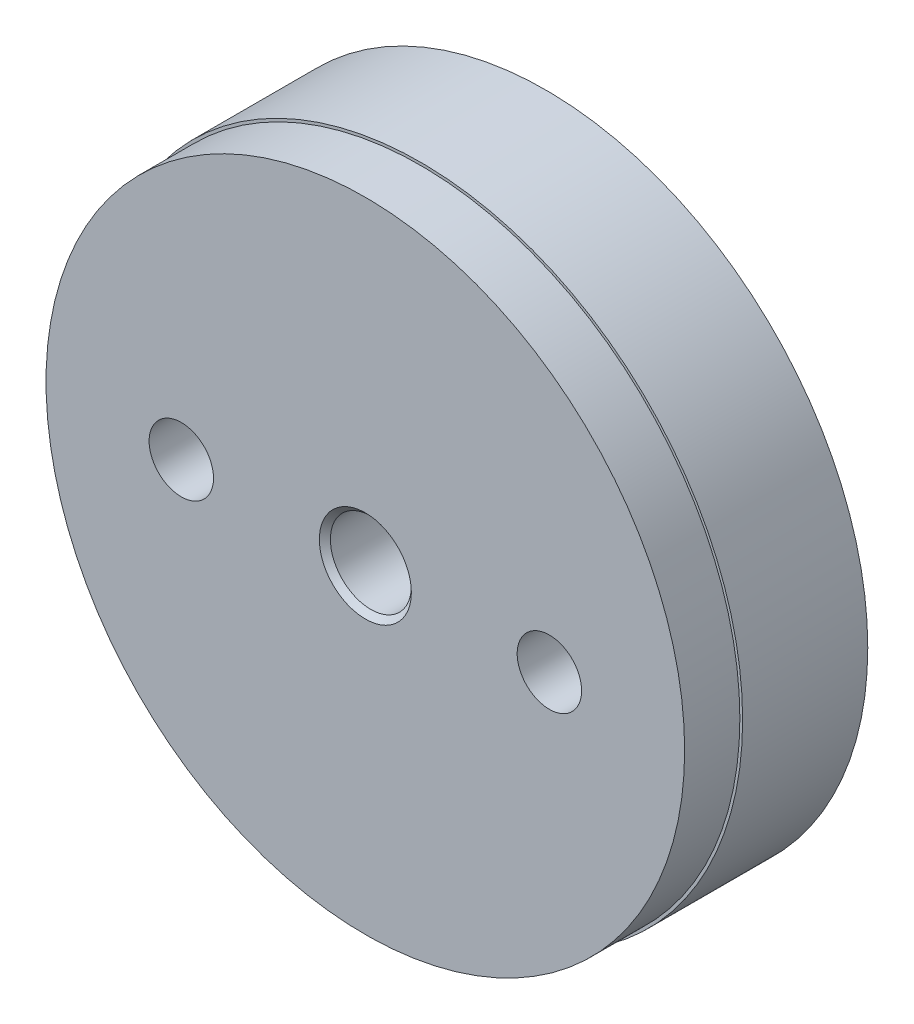
ISO-10303-21;
HEADER;
FILE_DESCRIPTION(('STEP AP214'),'2;1');
FILE_NAME('part.step','',(''),(''),'','','');
FILE_SCHEMA(('AUTOMOTIVE_DESIGN { 1 0 10303 214 1 1 1 1 }'));
ENDSEC;
DATA;
#1=APPLICATION_CONTEXT('core data for automotive mechanical design processes');
#2=APPLICATION_PROTOCOL_DEFINITION('international standard','automotive_design',2000,#1);
#3=PRODUCT_CONTEXT('',#1,'mechanical');
#4=PRODUCT('Part','Part','',(#3));
#5=PRODUCT_RELATED_PRODUCT_CATEGORY('part','',(#4));
#6=PRODUCT_DEFINITION_FORMATION('','',#4);
#7=PRODUCT_DEFINITION_CONTEXT('part definition',#1,'design');
#8=PRODUCT_DEFINITION('design','',#6,#7);
#9=PRODUCT_DEFINITION_SHAPE('','',#8);
#10=(LENGTH_UNIT() NAMED_UNIT(*) SI_UNIT(.MILLI.,.METRE.));
#11=(NAMED_UNIT(*) PLANE_ANGLE_UNIT() SI_UNIT($,.RADIAN.));
#12=(NAMED_UNIT(*) SI_UNIT($,.STERADIAN.) SOLID_ANGLE_UNIT());
#13=UNCERTAINTY_MEASURE_WITH_UNIT(LENGTH_MEASURE(1.E-05),#10,'distance_accuracy_value','');
#14=(GEOMETRIC_REPRESENTATION_CONTEXT(3) GLOBAL_UNCERTAINTY_ASSIGNED_CONTEXT((#13)) GLOBAL_UNIT_ASSIGNED_CONTEXT((#10,
#11,#12)) REPRESENTATION_CONTEXT('',''));
#15=CARTESIAN_POINT('',(0.,0.,0.));
#16=DIRECTION('',(0.,0.,1.));
#17=DIRECTION('',(1.,0.,0.));
#18=AXIS2_PLACEMENT_3D('',#15,#16,#17);
#19=CARTESIAN_POINT('',(0.,0.,49.));
#20=DIRECTION('',(0.,0.,-1.));
#21=DIRECTION('',(-1.,0.,0.));
#22=AXIS2_PLACEMENT_3D('',#19,#20,#21);
#23=CYLINDRICAL_SURFACE('',#22,87.5);
#24=CARTESIAN_POINT('',(0.,0.,0.));
#25=DIRECTION('',(0.,0.,1.));
#26=DIRECTION('',(1.,0.,0.));
#27=AXIS2_PLACEMENT_3D('',#24,#25,#26);
#28=CIRCLE('',#27,87.5);
#29=CARTESIAN_POINT('',(87.5,0.,0.));
#30=VERTEX_POINT('',#29);
#31=EDGE_CURVE('E10',#30,#30,#28,.T.);
#32=ORIENTED_EDGE('',*,*,#31,.T.);
#33=EDGE_LOOP('',(#32));
#34=FACE_BOUND('',#33,.T.);
#35=CARTESIAN_POINT('',(0.,0.,34.));
#36=DIRECTION('',(0.,0.,1.));
#37=DIRECTION('',(1.,0.,0.));
#38=AXIS2_PLACEMENT_3D('',#35,#36,#37);
#39=CIRCLE('',#38,87.5);
#40=CARTESIAN_POINT('',(87.5,0.,34.));
#41=VERTEX_POINT('',#40);
#42=EDGE_CURVE('E41',#41,#41,#39,.T.);
#43=ORIENTED_EDGE('',*,*,#42,.F.);
#44=EDGE_LOOP('',(#43));
#45=FACE_BOUND('',#44,.T.);
#46=ADVANCED_FACE('F35',(#34,#45),#23,.T.);
#47=CARTESIAN_POINT('',(0.,0.,0.));
#48=DIRECTION('',(0.,0.,1.));
#49=DIRECTION('',(1.,0.,0.));
#50=AXIS2_PLACEMENT_3D('',#47,#48,#49);
#51=PLANE('',#50);
#52=CARTESIAN_POINT('',(0.,0.,0.));
#53=DIRECTION('',(0.,0.,1.));
#54=DIRECTION('',(1.,0.,0.));
#55=AXIS2_PLACEMENT_3D('',#52,#53,#54);
#56=CIRCLE('',#55,12.5);
#57=CARTESIAN_POINT('',(12.5,0.,0.));
#58=VERTEX_POINT('',#57);
#59=EDGE_CURVE('E79',#58,#58,#56,.T.);
#60=ORIENTED_EDGE('',*,*,#59,.T.);
#61=EDGE_LOOP('',(#60));
#62=FACE_BOUND('',#61,.T.);
#63=CARTESIAN_POINT('',(-50.,0.,0.));
#64=DIRECTION('',(0.,0.,1.));
#65=DIRECTION('',(1.,0.,0.));
#66=AXIS2_PLACEMENT_3D('',#63,#64,#65);
#67=CIRCLE('',#66,8.74999999999999);
#68=CARTESIAN_POINT('',(-41.25,0.,0.));
#69=VERTEX_POINT('',#68);
#70=EDGE_CURVE('E62',#69,#69,#67,.T.);
#71=ORIENTED_EDGE('',*,*,#70,.T.);
#72=EDGE_LOOP('',(#71));
#73=FACE_BOUND('',#72,.T.);
#74=CARTESIAN_POINT('',(50.,0.,0.));
#75=DIRECTION('',(0.,0.,1.));
#76=DIRECTION('',(1.,0.,0.));
#77=AXIS2_PLACEMENT_3D('',#74,#75,#76);
#78=CIRCLE('',#77,8.74999999999999);
#79=CARTESIAN_POINT('',(58.75,0.,0.));
#80=VERTEX_POINT('',#79);
#81=EDGE_CURVE('E54',#80,#80,#78,.T.);
#82=ORIENTED_EDGE('',*,*,#81,.T.);
#83=EDGE_LOOP('',(#82));
#84=FACE_BOUND('',#83,.T.);
#85=ORIENTED_EDGE('',*,*,#31,.F.);
#86=EDGE_LOOP('',(#85));
#87=FACE_BOUND('',#86,.T.);
#88=ADVANCED_FACE('F83',(#62,#73,#84,#87),#51,.F.);
#89=CARTESIAN_POINT('',(0.,0.,34.));
#90=DIRECTION('',(0.,0.,1.));
#91=DIRECTION('',(1.,0.,0.));
#92=AXIS2_PLACEMENT_3D('',#89,#90,#91);
#93=CYLINDRICAL_SURFACE('',#92,86.75);
#94=CARTESIAN_POINT('',(0.,0.,34.));
#95=DIRECTION('',(0.,0.,1.));
#96=DIRECTION('',(1.,0.,0.));
#97=AXIS2_PLACEMENT_3D('',#94,#95,#96);
#98=CIRCLE('',#97,86.75);
#99=CARTESIAN_POINT('',(86.75,0.,34.));
#100=VERTEX_POINT('',#99);
#101=EDGE_CURVE('E45',#100,#100,#98,.T.);
#102=ORIENTED_EDGE('',*,*,#101,.T.);
#103=EDGE_LOOP('',(#102));
#104=FACE_BOUND('',#103,.T.);
#105=CARTESIAN_POINT('',(0.,0.,49.));
#106=DIRECTION('',(0.,0.,1.));
#107=DIRECTION('',(1.,0.,0.));
#108=AXIS2_PLACEMENT_3D('',#105,#106,#107);
#109=CIRCLE('',#108,86.75);
#110=CARTESIAN_POINT('',(86.75,0.,49.));
#111=VERTEX_POINT('',#110);
#112=EDGE_CURVE('E50',#111,#111,#109,.T.);
#113=ORIENTED_EDGE('',*,*,#112,.F.);
#114=EDGE_LOOP('',(#113));
#115=FACE_BOUND('',#114,.T.);
#116=ADVANCED_FACE('F128',(#104,#115),#93,.T.);
#117=CARTESIAN_POINT('',(0.,0.,34.));
#118=DIRECTION('',(0.,0.,1.));
#119=DIRECTION('',(1.,0.,0.));
#120=AXIS2_PLACEMENT_3D('',#117,#118,#119);
#121=PLANE('',#120);
#122=ORIENTED_EDGE('',*,*,#101,.F.);
#123=EDGE_LOOP('',(#122));
#124=FACE_BOUND('',#123,.T.);
#125=ORIENTED_EDGE('',*,*,#42,.T.);
#126=EDGE_LOOP('',(#125));
#127=FACE_BOUND('',#126,.T.);
#128=ADVANCED_FACE('F109',(#124,#127),#121,.T.);
#129=CARTESIAN_POINT('',(0.,0.,49.));
#130=DIRECTION('',(0.,0.,1.));
#131=DIRECTION('',(1.,0.,0.));
#132=AXIS2_PLACEMENT_3D('',#129,#130,#131);
#133=PLANE('',#132);
#134=CARTESIAN_POINT('',(0.,0.,49.));
#135=DIRECTION('',(0.,0.,1.));
#136=DIRECTION('',(1.,0.,0.));
#137=AXIS2_PLACEMENT_3D('',#134,#135,#136);
#138=CIRCLE('',#137,12.5);
#139=CARTESIAN_POINT('',(12.5,0.,49.));
#140=VERTEX_POINT('',#139);
#141=EDGE_CURVE('E76',#140,#140,#138,.T.);
#142=ORIENTED_EDGE('',*,*,#141,.F.);
#143=EDGE_LOOP('',(#142));
#144=FACE_BOUND('',#143,.T.);
#145=CARTESIAN_POINT('',(-50.,0.,49.));
#146=DIRECTION('',(0.,0.,1.));
#147=DIRECTION('',(1.,0.,0.));
#148=AXIS2_PLACEMENT_3D('',#145,#146,#147);
#149=CIRCLE('',#148,8.74999999999999);
#150=CARTESIAN_POINT('',(-41.25,0.,49.));
#151=VERTEX_POINT('',#150);
#152=EDGE_CURVE('E67',#151,#151,#149,.T.);
#153=ORIENTED_EDGE('',*,*,#152,.F.);
#154=EDGE_LOOP('',(#153));
#155=FACE_BOUND('',#154,.T.);
#156=CARTESIAN_POINT('',(50.,0.,49.));
#157=DIRECTION('',(0.,0.,1.));
#158=DIRECTION('',(1.,0.,0.));
#159=AXIS2_PLACEMENT_3D('',#156,#157,#158);
#160=CIRCLE('',#159,8.74999999999999);
#161=CARTESIAN_POINT('',(58.75,0.,49.));
#162=VERTEX_POINT('',#161);
#163=EDGE_CURVE('E58',#162,#162,#160,.T.);
#164=ORIENTED_EDGE('',*,*,#163,.F.);
#165=EDGE_LOOP('',(#164));
#166=FACE_BOUND('',#165,.T.);
#167=ORIENTED_EDGE('',*,*,#112,.T.);
#168=EDGE_LOOP('',(#167));
#169=FACE_BOUND('',#168,.T.);
#170=ADVANCED_FACE('F105',(#144,#155,#166,#169),#133,.T.);
#171=CARTESIAN_POINT('',(50.,0.,49.));
#172=DIRECTION('',(0.,0.,1.));
#173=DIRECTION('',(1.,0.,0.));
#174=AXIS2_PLACEMENT_3D('',#171,#172,#173);
#175=CYLINDRICAL_SURFACE('',#174,8.74999999999999);
#176=ORIENTED_EDGE('',*,*,#81,.F.);
#177=EDGE_LOOP('',(#176));
#178=FACE_BOUND('',#177,.T.);
#179=ORIENTED_EDGE('',*,*,#163,.T.);
#180=EDGE_LOOP('',(#179));
#181=FACE_BOUND('',#180,.T.);
#182=ADVANCED_FACE('F108',(#178,#181),#175,.F.);
#183=CARTESIAN_POINT('',(-50.,0.,49.));
#184=DIRECTION('',(0.,0.,1.));
#185=DIRECTION('',(1.,0.,0.));
#186=AXIS2_PLACEMENT_3D('',#183,#184,#185);
#187=CYLINDRICAL_SURFACE('',#186,8.74999999999999);
#188=ORIENTED_EDGE('',*,*,#70,.F.);
#189=EDGE_LOOP('',(#188));
#190=FACE_BOUND('',#189,.T.);
#191=ORIENTED_EDGE('',*,*,#152,.T.);
#192=EDGE_LOOP('',(#191));
#193=FACE_BOUND('',#192,.T.);
#194=ADVANCED_FACE('F90',(#190,#193),#187,.F.);
#195=CARTESIAN_POINT('',(0.,0.,1.50000000000002));
#196=DIRECTION('',(0.,0.,-1.));
#197=DIRECTION('',(-1.,0.,0.));
#198=AXIS2_PLACEMENT_3D('',#195,#196,#197);
#199=CONICAL_SURFACE('',#198,11.,0.785398163397443);
#200=ORIENTED_EDGE('',*,*,#59,.F.);
#201=EDGE_LOOP('',(#200));
#202=FACE_BOUND('',#201,.T.);
#203=CARTESIAN_POINT('',(0.,0.,1.50000000000002));
#204=DIRECTION('',(0.,0.,1.));
#205=DIRECTION('',(1.,0.,0.));
#206=AXIS2_PLACEMENT_3D('',#203,#204,#205);
#207=CIRCLE('',#206,11.);
#208=CARTESIAN_POINT('',(11.,0.,1.50000000000002));
#209=VERTEX_POINT('',#208);
#210=EDGE_CURVE('E70',#209,#209,#207,.T.);
#211=ORIENTED_EDGE('',*,*,#210,.T.);
#212=EDGE_LOOP('',(#211));
#213=FACE_BOUND('',#212,.T.);
#214=ADVANCED_FACE('F86',(#202,#213),#199,.F.);
#215=CARTESIAN_POINT('',(0.,0.,49.));
#216=DIRECTION('',(0.,0.,1.));
#217=DIRECTION('',(1.,0.,0.));
#218=AXIS2_PLACEMENT_3D('',#215,#216,#217);
#219=CYLINDRICAL_SURFACE('',#218,11.);
#220=ORIENTED_EDGE('',*,*,#210,.F.);
#221=EDGE_LOOP('',(#220));
#222=FACE_BOUND('',#221,.T.);
#223=CARTESIAN_POINT('',(0.,0.,47.5));
#224=DIRECTION('',(0.,0.,1.));
#225=DIRECTION('',(1.,0.,0.));
#226=AXIS2_PLACEMENT_3D('',#223,#224,#225);
#227=CIRCLE('',#226,11.);
#228=CARTESIAN_POINT('',(11.,0.,47.5));
#229=VERTEX_POINT('',#228);
#230=EDGE_CURVE('E73',#229,#229,#227,.T.);
#231=ORIENTED_EDGE('',*,*,#230,.T.);
#232=EDGE_LOOP('',(#231));
#233=FACE_BOUND('',#232,.T.);
#234=ADVANCED_FACE('F89',(#222,#233),#219,.F.);
#235=CARTESIAN_POINT('',(0.,0.,49.));
#236=DIRECTION('',(0.,0.,1.));
#237=DIRECTION('',(1.,0.,0.));
#238=AXIS2_PLACEMENT_3D('',#235,#236,#237);
#239=CONICAL_SURFACE('',#238,12.5,0.785398163397448);
#240=ORIENTED_EDGE('',*,*,#230,.F.);
#241=EDGE_LOOP('',(#240));
#242=FACE_BOUND('',#241,.T.);
#243=ORIENTED_EDGE('',*,*,#141,.T.);
#244=EDGE_LOOP('',(#243));
#245=FACE_BOUND('',#244,.T.);
#246=ADVANCED_FACE('F96',(#242,#245),#239,.F.);
#247=CLOSED_SHELL('',(#46,#88,#116,#128,#170,#182,#194,#214,#234,#246));
#248=MANIFOLD_SOLID_BREP('B2',#247);
#249=ADVANCED_BREP_SHAPE_REPRESENTATION('',(#18,#248),#14);
#250=SHAPE_DEFINITION_REPRESENTATION(#9,#249);
ENDSEC;
END-ISO-10303-21;
